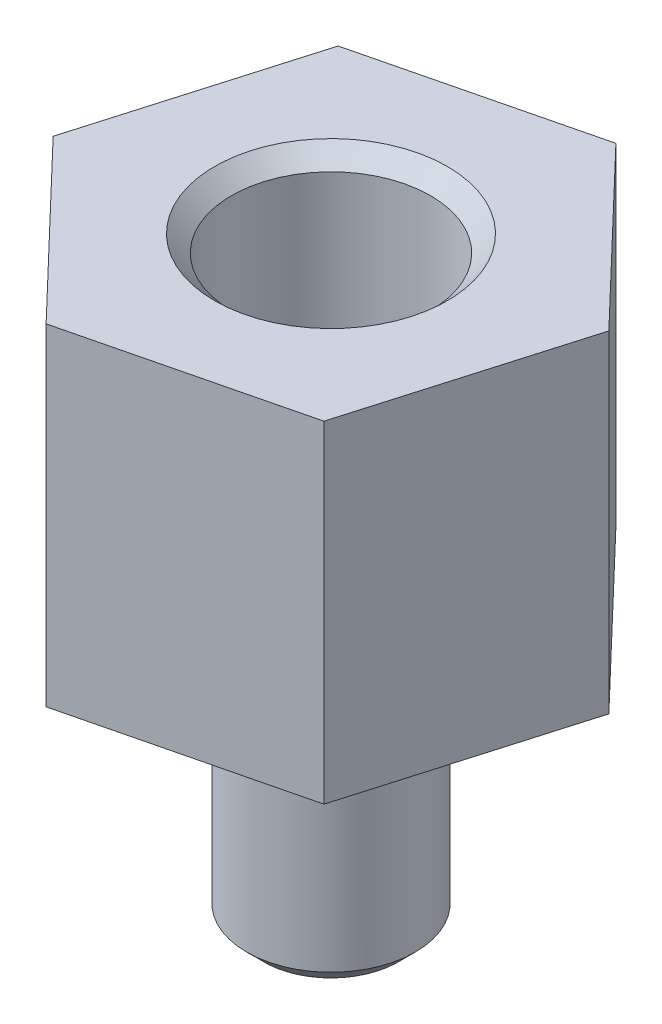
ISO-10303-21;
HEADER;
FILE_DESCRIPTION(('STEP AP214'),'2;1');
FILE_NAME('part.step','',(''),(''),'','','');
FILE_SCHEMA(('AUTOMOTIVE_DESIGN { 1 0 10303 214 1 1 1 1 }'));
ENDSEC;
DATA;
#1=APPLICATION_CONTEXT('core data for automotive mechanical design processes');
#2=APPLICATION_PROTOCOL_DEFINITION('international standard','automotive_design',2000,#1);
#3=PRODUCT_CONTEXT('',#1,'mechanical');
#4=PRODUCT('Part','Part','',(#3));
#5=PRODUCT_RELATED_PRODUCT_CATEGORY('part','',(#4));
#6=PRODUCT_DEFINITION_FORMATION('','',#4);
#7=PRODUCT_DEFINITION_CONTEXT('part definition',#1,'design');
#8=PRODUCT_DEFINITION('design','',#6,#7);
#9=PRODUCT_DEFINITION_SHAPE('','',#8);
#10=(LENGTH_UNIT() NAMED_UNIT(*) SI_UNIT(.MILLI.,.METRE.));
#11=(NAMED_UNIT(*) PLANE_ANGLE_UNIT() SI_UNIT($,.RADIAN.));
#12=(NAMED_UNIT(*) SI_UNIT($,.STERADIAN.) SOLID_ANGLE_UNIT());
#13=UNCERTAINTY_MEASURE_WITH_UNIT(LENGTH_MEASURE(1.E-05),#10,'distance_accuracy_value','');
#14=(GEOMETRIC_REPRESENTATION_CONTEXT(3) GLOBAL_UNCERTAINTY_ASSIGNED_CONTEXT((#13)) GLOBAL_UNIT_ASSIGNED_CONTEXT((#10,
#11,#12)) REPRESENTATION_CONTEXT('',''));
#15=CARTESIAN_POINT('',(0.,0.,0.));
#16=DIRECTION('',(0.,0.,1.));
#17=DIRECTION('',(1.,0.,0.));
#18=AXIS2_PLACEMENT_3D('',#15,#16,#17);
#19=CARTESIAN_POINT('',(-0.969087057041978,5.,3.32578866975546));
#20=DIRECTION('',(-0.237764481677284,0.,-0.971322835751705));
#21=DIRECTION('',(-0.971322835751705,0.,0.237764481677284));
#22=AXIS2_PLACEMENT_3D('',#19,#20,#21);
#23=PLANE('',#22);
#24=DIRECTION('',(0.971322835751705,0.,-0.237764481677284));
#25=VECTOR('',#24,1.);
#26=CARTESIAN_POINT('',(-0.969087057041978,0.,3.32578866975546));
#27=LINE('',#26,#25);
#28=CARTESIAN_POINT('',(-0.969087057041978,0.,3.32578866975546));
#29=VERTEX_POINT('',#28);
#30=CARTESIAN_POINT('',(2.39567394710569,0.,2.50214834475479));
#31=VERTEX_POINT('',#30);
#32=EDGE_CURVE('E120',#29,#31,#27,.T.);
#33=ORIENTED_EDGE('',*,*,#32,.T.);
#34=DIRECTION('',(0.,-1.,0.));
#35=VECTOR('',#34,1.);
#36=CARTESIAN_POINT('',(2.39567394710569,5.,2.50214834475479));
#37=LINE('',#36,#35);
#38=CARTESIAN_POINT('',(2.39567394710569,5.,2.50214834475479));
#39=VERTEX_POINT('',#38);
#40=EDGE_CURVE('E138',#39,#31,#37,.T.);
#41=ORIENTED_EDGE('',*,*,#40,.F.);
#42=DIRECTION('',(0.971322835751705,0.,-0.237764481677284));
#43=VECTOR('',#42,1.);
#44=CARTESIAN_POINT('',(-0.969087057041978,5.,3.32578866975546));
#45=LINE('',#44,#43);
#46=CARTESIAN_POINT('',(-0.969087057041978,5.,3.32578866975546));
#47=VERTEX_POINT('',#46);
#48=EDGE_CURVE('E131',#47,#39,#45,.T.);
#49=ORIENTED_EDGE('',*,*,#48,.F.);
#50=DIRECTION('',(0.,-1.,0.));
#51=VECTOR('',#50,1.);
#52=CARTESIAN_POINT('',(-0.969087057041978,5.,3.32578866975546));
#53=LINE('',#52,#51);
#54=EDGE_CURVE('E116',#47,#29,#53,.T.);
#55=ORIENTED_EDGE('',*,*,#54,.T.);
#56=EDGE_LOOP('',(#33,#41,#49,#55));
#57=FACE_BOUND('',#56,.T.);
#58=ADVANCED_FACE('F34',(#57),#23,.F.);
#59=CARTESIAN_POINT('',(2.39567394710569,5.,2.50214834475479));
#60=DIRECTION('',(-0.960072491875558,0.,-0.279751336625685));
#61=DIRECTION('',(-0.279751336625685,0.,0.960072491875558));
#62=AXIS2_PLACEMENT_3D('',#59,#60,#61);
#63=PLANE('',#62);
#64=DIRECTION('',(0.279751336625685,0.,-0.960072491875558));
#65=VECTOR('',#64,1.);
#66=CARTESIAN_POINT('',(2.39567394710569,0.,2.50214834475479));
#67=LINE('',#66,#65);
#68=CARTESIAN_POINT('',(3.36476100414768,0.,-0.823640325000672));
#69=VERTEX_POINT('',#68);
#70=EDGE_CURVE('E123',#31,#69,#67,.T.);
#71=ORIENTED_EDGE('',*,*,#70,.T.);
#72=DIRECTION('',(0.,-1.,0.));
#73=VECTOR('',#72,1.);
#74=CARTESIAN_POINT('',(3.36476100414768,5.,-0.823640325000672));
#75=LINE('',#74,#73);
#76=CARTESIAN_POINT('',(3.36476100414768,5.,-0.823640325000672));
#77=VERTEX_POINT('',#76);
#78=EDGE_CURVE('E135',#77,#69,#75,.T.);
#79=ORIENTED_EDGE('',*,*,#78,.F.);
#80=DIRECTION('',(0.279751336625685,0.,-0.960072491875558));
#81=VECTOR('',#80,1.);
#82=CARTESIAN_POINT('',(2.39567394710569,5.,2.50214834475479));
#83=LINE('',#82,#81);
#84=EDGE_CURVE('E89',#39,#77,#83,.T.);
#85=ORIENTED_EDGE('',*,*,#84,.F.);
#86=ORIENTED_EDGE('',*,*,#40,.T.);
#87=EDGE_LOOP('',(#71,#79,#85,#86));
#88=FACE_BOUND('',#87,.T.);
#89=ADVANCED_FACE('F164',(#88),#63,.F.);
#90=CARTESIAN_POINT('',(3.36476100414768,5.,-0.823640325000672));
#91=DIRECTION('',(-0.722308010198274,0.,0.69157149912602));
#92=DIRECTION('',(0.69157149912602,0.,0.722308010198274));
#93=AXIS2_PLACEMENT_3D('',#90,#91,#92);
#94=PLANE('',#93);
#95=DIRECTION('',(-0.69157149912602,0.,-0.722308010198274));
#96=VECTOR('',#95,1.);
#97=CARTESIAN_POINT('',(3.36476100414768,0.,-0.823640325000672));
#98=LINE('',#97,#96);
#99=CARTESIAN_POINT('',(0.969087057041985,0.,-3.32578866975546));
#100=VERTEX_POINT('',#99);
#101=EDGE_CURVE('E126',#69,#100,#98,.T.);
#102=ORIENTED_EDGE('',*,*,#101,.T.);
#103=DIRECTION('',(0.,-1.,0.));
#104=VECTOR('',#103,1.);
#105=CARTESIAN_POINT('',(0.969087057041985,5.,-3.32578866975546));
#106=LINE('',#105,#104);
#107=CARTESIAN_POINT('',(0.969087057041985,5.,-3.32578866975546));
#108=VERTEX_POINT('',#107);
#109=EDGE_CURVE('E111',#108,#100,#106,.T.);
#110=ORIENTED_EDGE('',*,*,#109,.F.);
#111=DIRECTION('',(-0.69157149912602,0.,-0.722308010198274));
#112=VECTOR('',#111,1.);
#113=CARTESIAN_POINT('',(3.36476100414768,5.,-0.823640325000672));
#114=LINE('',#113,#112);
#115=EDGE_CURVE('E102',#77,#108,#114,.T.);
#116=ORIENTED_EDGE('',*,*,#115,.F.);
#117=ORIENTED_EDGE('',*,*,#78,.T.);
#118=EDGE_LOOP('',(#102,#110,#116,#117));
#119=FACE_BOUND('',#118,.T.);
#120=ADVANCED_FACE('F170',(#119),#94,.F.);
#121=CARTESIAN_POINT('',(0.969087057041985,5.,-3.32578866975546));
#122=DIRECTION('',(0.237764481677284,0.,0.971322835751704));
#123=DIRECTION('',(0.971322835751705,0.,-0.237764481677284));
#124=AXIS2_PLACEMENT_3D('',#121,#122,#123);
#125=PLANE('',#124);
#126=DIRECTION('',(-0.971322835751704,0.,0.237764481677284));
#127=VECTOR('',#126,1.);
#128=CARTESIAN_POINT('',(0.969087057041985,0.,-3.32578866975546));
#129=LINE('',#128,#127);
#130=CARTESIAN_POINT('',(-2.39567394710569,0.,-2.50214834475479));
#131=VERTEX_POINT('',#130);
#132=EDGE_CURVE('E110',#100,#131,#129,.T.);
#133=ORIENTED_EDGE('',*,*,#132,.T.);
#134=DIRECTION('',(0.,-1.,0.));
#135=VECTOR('',#134,1.);
#136=CARTESIAN_POINT('',(-2.39567394710569,5.,-2.50214834475479));
#137=LINE('',#136,#135);
#138=CARTESIAN_POINT('',(-2.39567394710569,5.,-2.50214834475479));
#139=VERTEX_POINT('',#138);
#140=EDGE_CURVE('E107',#139,#131,#137,.T.);
#141=ORIENTED_EDGE('',*,*,#140,.F.);
#142=DIRECTION('',(-0.971322835751704,0.,0.237764481677284));
#143=VECTOR('',#142,1.);
#144=CARTESIAN_POINT('',(0.969087057041985,5.,-3.32578866975546));
#145=LINE('',#144,#143);
#146=EDGE_CURVE('E96',#108,#139,#145,.T.);
#147=ORIENTED_EDGE('',*,*,#146,.F.);
#148=ORIENTED_EDGE('',*,*,#109,.T.);
#149=EDGE_LOOP('',(#133,#141,#147,#148));
#150=FACE_BOUND('',#149,.T.);
#151=ADVANCED_FACE('F108',(#150),#125,.F.);
#152=CARTESIAN_POINT('',(-2.39567394710569,5.,-2.50214834475479));
#153=DIRECTION('',(0.960072491875557,0.,0.279751336625685));
#154=DIRECTION('',(0.279751336625685,0.,-0.960072491875558));
#155=AXIS2_PLACEMENT_3D('',#152,#153,#154);
#156=PLANE('',#155);
#157=DIRECTION('',(-0.279751336625685,0.,0.960072491875557));
#158=VECTOR('',#157,1.);
#159=CARTESIAN_POINT('',(-2.39567394710569,0.,-2.50214834475479));
#160=LINE('',#159,#158);
#161=CARTESIAN_POINT('',(-3.36476100414767,0.,0.82364032500067));
#162=VERTEX_POINT('',#161);
#163=EDGE_CURVE('E74',#131,#162,#160,.T.);
#164=ORIENTED_EDGE('',*,*,#163,.T.);
#165=DIRECTION('',(0.,-1.,0.));
#166=VECTOR('',#165,1.);
#167=CARTESIAN_POINT('',(-3.36476100414767,5.,0.82364032500067));
#168=LINE('',#167,#166);
#169=CARTESIAN_POINT('',(-3.36476100414767,5.,0.82364032500067));
#170=VERTEX_POINT('',#169);
#171=EDGE_CURVE('E112',#170,#162,#168,.T.);
#172=ORIENTED_EDGE('',*,*,#171,.F.);
#173=DIRECTION('',(-0.279751336625685,0.,0.960072491875557));
#174=VECTOR('',#173,1.);
#175=CARTESIAN_POINT('',(-2.39567394710569,5.,-2.50214834475479));
#176=LINE('',#175,#174);
#177=EDGE_CURVE('E100',#139,#170,#176,.T.);
#178=ORIENTED_EDGE('',*,*,#177,.F.);
#179=ORIENTED_EDGE('',*,*,#140,.T.);
#180=EDGE_LOOP('',(#164,#172,#178,#179));
#181=FACE_BOUND('',#180,.T.);
#182=ADVANCED_FACE('F114',(#181),#156,.F.);
#183=CARTESIAN_POINT('',(-3.36476100414767,5.,0.82364032500067));
#184=DIRECTION('',(0.722308010198274,0.,-0.69157149912602));
#185=DIRECTION('',(-0.69157149912602,0.,-0.722308010198274));
#186=AXIS2_PLACEMENT_3D('',#183,#184,#185);
#187=PLANE('',#186);
#188=DIRECTION('',(0.69157149912602,0.,0.722308010198274));
#189=VECTOR('',#188,1.);
#190=CARTESIAN_POINT('',(-3.36476100414767,0.,0.82364032500067));
#191=LINE('',#190,#189);
#192=EDGE_CURVE('E80',#162,#29,#191,.T.);
#193=ORIENTED_EDGE('',*,*,#192,.T.);
#194=ORIENTED_EDGE('',*,*,#54,.F.);
#195=DIRECTION('',(0.69157149912602,0.,0.722308010198274));
#196=VECTOR('',#195,1.);
#197=CARTESIAN_POINT('',(-3.36476100414767,5.,0.82364032500067));
#198=LINE('',#197,#196);
#199=EDGE_CURVE('E51',#170,#47,#198,.T.);
#200=ORIENTED_EDGE('',*,*,#199,.F.);
#201=ORIENTED_EDGE('',*,*,#171,.T.);
#202=EDGE_LOOP('',(#193,#194,#200,#201));
#203=FACE_BOUND('',#202,.T.);
#204=ADVANCED_FACE('F180',(#203),#187,.F.);
#205=CARTESIAN_POINT('',(0.,5.,0.));
#206=DIRECTION('',(0.,1.,0.));
#207=DIRECTION('',(0.,0.,1.));
#208=AXIS2_PLACEMENT_3D('',#205,#206,#207);
#209=PLANE('',#208);
#210=CARTESIAN_POINT('',(0.,5.,0.));
#211=DIRECTION('',(0.,1.,0.));
#212=DIRECTION('',(0.,0.,1.));
#213=AXIS2_PLACEMENT_3D('',#210,#211,#212);
#214=CIRCLE('',#213,1.754);
#215=CARTESIAN_POINT('',(0.,5.,1.754));
#216=VERTEX_POINT('',#215);
#217=EDGE_CURVE('E11',#216,#216,#214,.F.);
#218=ORIENTED_EDGE('',*,*,#217,.T.);
#219=EDGE_LOOP('',(#218));
#220=FACE_BOUND('',#219,.T.);
#221=ORIENTED_EDGE('',*,*,#48,.T.);
#222=ORIENTED_EDGE('',*,*,#84,.T.);
#223=ORIENTED_EDGE('',*,*,#115,.T.);
#224=ORIENTED_EDGE('',*,*,#146,.T.);
#225=ORIENTED_EDGE('',*,*,#177,.T.);
#226=ORIENTED_EDGE('',*,*,#199,.T.);
#227=EDGE_LOOP('',(#221,#222,#223,#224,#225,#226));
#228=FACE_BOUND('',#227,.T.);
#229=ADVANCED_FACE('F98',(#220,#228),#209,.T.);
#230=CARTESIAN_POINT('',(0.,0.,0.));
#231=DIRECTION('',(0.,1.,0.));
#232=DIRECTION('',(0.,0.,1.));
#233=AXIS2_PLACEMENT_3D('',#230,#231,#232);
#234=PLANE('',#233);
#235=CARTESIAN_POINT('',(0.,0.,0.));
#236=DIRECTION('',(0.,1.,0.));
#237=DIRECTION('',(0.,0.,1.));
#238=AXIS2_PLACEMENT_3D('',#235,#236,#237);
#239=CIRCLE('',#238,1.27);
#240=CARTESIAN_POINT('',(0.,0.,1.27));
#241=VERTEX_POINT('',#240);
#242=EDGE_CURVE('E140',#241,#241,#239,.F.);
#243=ORIENTED_EDGE('',*,*,#242,.F.);
#244=EDGE_LOOP('',(#243));
#245=FACE_BOUND('',#244,.T.);
#246=ORIENTED_EDGE('',*,*,#32,.F.);
#247=ORIENTED_EDGE('',*,*,#192,.F.);
#248=ORIENTED_EDGE('',*,*,#163,.F.);
#249=ORIENTED_EDGE('',*,*,#132,.F.);
#250=ORIENTED_EDGE('',*,*,#101,.F.);
#251=ORIENTED_EDGE('',*,*,#70,.F.);
#252=EDGE_LOOP('',(#246,#247,#248,#249,#250,#251));
#253=FACE_BOUND('',#252,.T.);
#254=ADVANCED_FACE('F183',(#245,#253),#234,.F.);
#255=CARTESIAN_POINT('',(0.,1.,0.));
#256=DIRECTION('',(0.,1.,0.));
#257=DIRECTION('',(0.,0.,1.));
#258=AXIS2_PLACEMENT_3D('',#255,#256,#257);
#259=CYLINDRICAL_SURFACE('',#258,1.5);
#260=CARTESIAN_POINT('',(0.,4.746,0.));
#261=DIRECTION('',(0.,1.,0.));
#262=DIRECTION('',(0.,0.,1.));
#263=AXIS2_PLACEMENT_3D('',#260,#261,#262);
#264=CIRCLE('',#263,1.5);
#265=CARTESIAN_POINT('',(0.,4.746,1.5));
#266=VERTEX_POINT('',#265);
#267=EDGE_CURVE('E43',#266,#266,#264,.T.);
#268=ORIENTED_EDGE('',*,*,#267,.T.);
#269=EDGE_LOOP('',(#268));
#270=FACE_BOUND('',#269,.T.);
#271=CARTESIAN_POINT('',(0.,1.,0.));
#272=DIRECTION('',(0.,1.,0.));
#273=DIRECTION('',(0.,0.,1.));
#274=AXIS2_PLACEMENT_3D('',#271,#272,#273);
#275=CIRCLE('',#274,1.5);
#276=CARTESIAN_POINT('',(0.,1.,1.5));
#277=VERTEX_POINT('',#276);
#278=EDGE_CURVE('E124',#277,#277,#275,.T.);
#279=ORIENTED_EDGE('',*,*,#278,.F.);
#280=EDGE_LOOP('',(#279));
#281=FACE_BOUND('',#280,.T.);
#282=ADVANCED_FACE('F151',(#270,#281),#259,.F.);
#283=CARTESIAN_POINT('',(0.,1.,0.));
#284=DIRECTION('',(0.,1.,0.));
#285=DIRECTION('',(0.,0.,1.));
#286=AXIS2_PLACEMENT_3D('',#283,#284,#285);
#287=PLANE('',#286);
#288=ORIENTED_EDGE('',*,*,#278,.T.);
#289=EDGE_LOOP('',(#288));
#290=FACE_BOUND('',#289,.T.);
#291=ADVANCED_FACE('F192',(#290),#287,.T.);
#292=CARTESIAN_POINT('',(0.,-4.,0.));
#293=DIRECTION('',(0.,1.,0.));
#294=DIRECTION('',(0.,0.,1.));
#295=AXIS2_PLACEMENT_3D('',#292,#293,#294);
#296=CYLINDRICAL_SURFACE('',#295,1.27);
#297=CARTESIAN_POINT('',(0.,-3.746,0.));
#298=DIRECTION('',(0.,-1.,0.));
#299=DIRECTION('',(0.,0.,-1.));
#300=AXIS2_PLACEMENT_3D('',#297,#298,#299);
#301=CIRCLE('',#300,1.27);
#302=CARTESIAN_POINT('',(0.,-3.746,-1.27));
#303=VERTEX_POINT('',#302);
#304=EDGE_CURVE('E146',#303,#303,#301,.F.);
#305=ORIENTED_EDGE('',*,*,#304,.T.);
#306=EDGE_LOOP('',(#305));
#307=FACE_BOUND('',#306,.T.);
#308=ORIENTED_EDGE('',*,*,#242,.T.);
#309=EDGE_LOOP('',(#308));
#310=FACE_BOUND('',#309,.T.);
#311=ADVANCED_FACE('F195',(#307,#310),#296,.T.);
#312=CARTESIAN_POINT('',(0.,-4.,0.));
#313=DIRECTION('',(0.,-1.,0.));
#314=DIRECTION('',(0.,0.,-1.));
#315=AXIS2_PLACEMENT_3D('',#312,#313,#314);
#316=PLANE('',#315);
#317=CARTESIAN_POINT('',(0.,-4.,0.));
#318=DIRECTION('',(0.,-1.,0.));
#319=DIRECTION('',(0.,0.,-1.));
#320=AXIS2_PLACEMENT_3D('',#317,#318,#319);
#321=CIRCLE('',#320,1.016);
#322=CARTESIAN_POINT('',(0.,-4.,-1.016));
#323=VERTEX_POINT('',#322);
#324=EDGE_CURVE('E143',#323,#323,#321,.T.);
#325=ORIENTED_EDGE('',*,*,#324,.T.);
#326=EDGE_LOOP('',(#325));
#327=FACE_BOUND('',#326,.T.);
#328=ADVANCED_FACE('F160',(#327),#316,.T.);
#329=CARTESIAN_POINT('',(0.,-4.,0.));
#330=DIRECTION('',(0.,1.,0.));
#331=DIRECTION('',(0.,0.,1.));
#332=AXIS2_PLACEMENT_3D('',#329,#330,#331);
#333=CONICAL_SURFACE('',#332,1.016,0.785398163397446);
#334=ORIENTED_EDGE('',*,*,#304,.F.);
#335=EDGE_LOOP('',(#334));
#336=FACE_BOUND('',#335,.T.);
#337=ORIENTED_EDGE('',*,*,#324,.F.);
#338=EDGE_LOOP('',(#337));
#339=FACE_BOUND('',#338,.T.);
#340=ADVANCED_FACE('F155',(#336,#339),#333,.T.);
#341=CARTESIAN_POINT('',(0.,4.746,0.));
#342=DIRECTION('',(0.,1.,0.));
#343=DIRECTION('',(0.,0.,1.));
#344=AXIS2_PLACEMENT_3D('',#341,#342,#343);
#345=CONICAL_SURFACE('',#344,1.5,0.785398163397444);
#346=ORIENTED_EDGE('',*,*,#217,.F.);
#347=EDGE_LOOP('',(#346));
#348=FACE_BOUND('',#347,.T.);
#349=ORIENTED_EDGE('',*,*,#267,.F.);
#350=EDGE_LOOP('',(#349));
#351=FACE_BOUND('',#350,.T.);
#352=ADVANCED_FACE('F36',(#348,#351),#345,.F.);
#353=CLOSED_SHELL('',(#58,#89,#120,#151,#182,#204,#229,#254,#282,#291,#311,#328,#340,#352));
#354=MANIFOLD_SOLID_BREP('B2',#353);
#355=ADVANCED_BREP_SHAPE_REPRESENTATION('',(#18,#354),#14);
#356=SHAPE_DEFINITION_REPRESENTATION(#9,#355);
ENDSEC;
END-ISO-10303-21;
